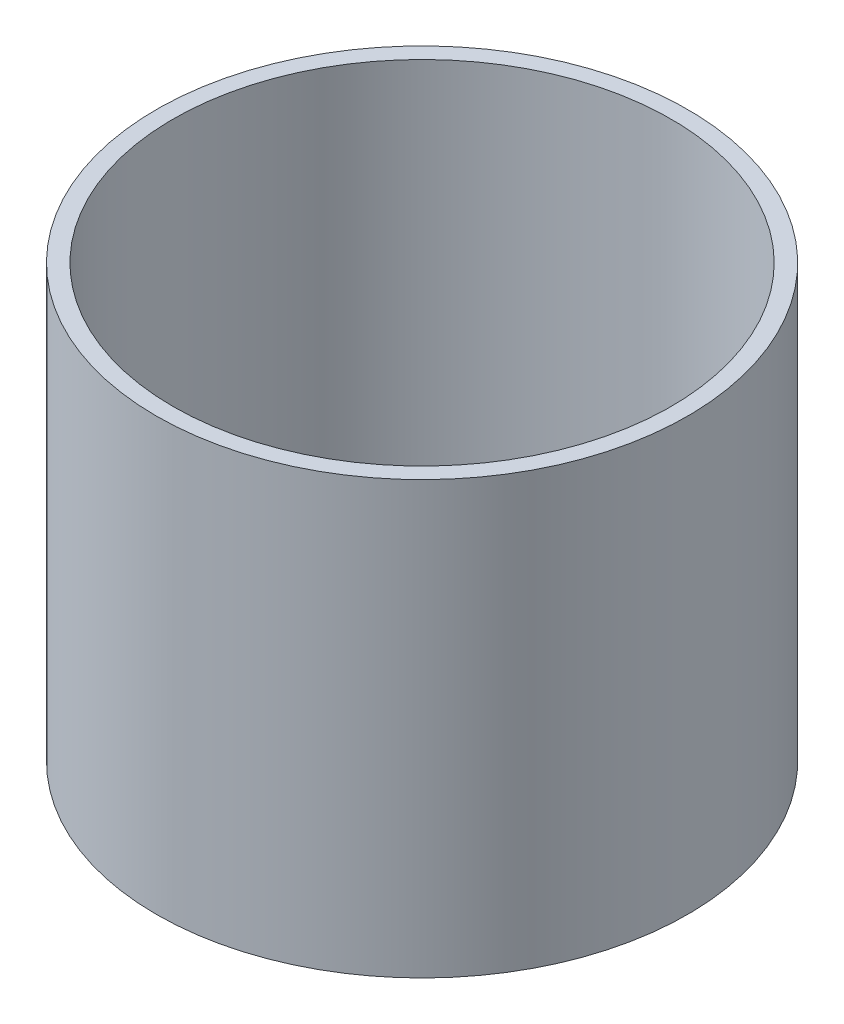
ISO-10303-21;
HEADER;
FILE_DESCRIPTION(('STEP AP214'),'2;1');
FILE_NAME('part.step','',(''),(''),'','','');
FILE_SCHEMA(('AUTOMOTIVE_DESIGN { 1 0 10303 214 1 1 1 1 }'));
ENDSEC;
DATA;
#1=APPLICATION_CONTEXT('core data for automotive mechanical design processes');
#2=APPLICATION_PROTOCOL_DEFINITION('international standard','automotive_design',2000,#1);
#3=PRODUCT_CONTEXT('',#1,'mechanical');
#4=PRODUCT('Part','Part','',(#3));
#5=PRODUCT_RELATED_PRODUCT_CATEGORY('part','',(#4));
#6=PRODUCT_DEFINITION_FORMATION('','',#4);
#7=PRODUCT_DEFINITION_CONTEXT('part definition',#1,'design');
#8=PRODUCT_DEFINITION('design','',#6,#7);
#9=PRODUCT_DEFINITION_SHAPE('','',#8);
#10=(LENGTH_UNIT() NAMED_UNIT(*) SI_UNIT(.MILLI.,.METRE.));
#11=(NAMED_UNIT(*) PLANE_ANGLE_UNIT() SI_UNIT($,.RADIAN.));
#12=(NAMED_UNIT(*) SI_UNIT($,.STERADIAN.) SOLID_ANGLE_UNIT());
#13=UNCERTAINTY_MEASURE_WITH_UNIT(LENGTH_MEASURE(1.E-05),#10,'distance_accuracy_value','');
#14=(GEOMETRIC_REPRESENTATION_CONTEXT(3) GLOBAL_UNCERTAINTY_ASSIGNED_CONTEXT((#13)) GLOBAL_UNIT_ASSIGNED_CONTEXT((#10,
#11,#12)) REPRESENTATION_CONTEXT('',''));
#15=CARTESIAN_POINT('',(0.,0.,0.));
#16=DIRECTION('',(0.,0.,1.));
#17=DIRECTION('',(1.,0.,0.));
#18=AXIS2_PLACEMENT_3D('',#15,#16,#17);
#19=CARTESIAN_POINT('',(0.,65.,0.));
#20=DIRECTION('',(0.,1.,0.));
#21=DIRECTION('',(0.,0.,1.));
#22=AXIS2_PLACEMENT_3D('',#19,#20,#21);
#23=PLANE('',#22);
#24=CARTESIAN_POINT('',(0.,65.,0.));
#25=DIRECTION('',(0.,1.,0.));
#26=DIRECTION('',(0.,0.,1.));
#27=AXIS2_PLACEMENT_3D('',#24,#25,#26);
#28=CIRCLE('',#27,40.);
#29=CARTESIAN_POINT('',(0.,65.,40.));
#30=VERTEX_POINT('',#29);
#31=EDGE_CURVE('E10',#30,#30,#28,.T.);
#32=ORIENTED_EDGE('',*,*,#31,.T.);
#33=EDGE_LOOP('',(#32));
#34=FACE_BOUND('',#33,.T.);
#35=CARTESIAN_POINT('',(0.,65.,0.));
#36=DIRECTION('',(0.,1.,0.));
#37=DIRECTION('',(0.,0.,1.));
#38=AXIS2_PLACEMENT_3D('',#35,#36,#37);
#39=CIRCLE('',#38,37.5);
#40=CARTESIAN_POINT('',(0.,65.,37.5));
#41=VERTEX_POINT('',#40);
#42=EDGE_CURVE('E54',#41,#41,#39,.T.);
#43=ORIENTED_EDGE('',*,*,#42,.F.);
#44=EDGE_LOOP('',(#43));
#45=FACE_BOUND('',#44,.T.);
#46=ADVANCED_FACE('F41',(#34,#45),#23,.T.);
#47=CARTESIAN_POINT('',(0.,0.,0.));
#48=DIRECTION('',(0.,1.,0.));
#49=DIRECTION('',(0.,0.,1.));
#50=AXIS2_PLACEMENT_3D('',#47,#48,#49);
#51=PLANE('',#50);
#52=CARTESIAN_POINT('',(0.,0.,0.));
#53=DIRECTION('',(0.,1.,0.));
#54=DIRECTION('',(0.,0.,1.));
#55=AXIS2_PLACEMENT_3D('',#52,#53,#54);
#56=CIRCLE('',#55,40.);
#57=CARTESIAN_POINT('',(0.,0.,40.));
#58=VERTEX_POINT('',#57);
#59=EDGE_CURVE('E45',#58,#58,#56,.T.);
#60=ORIENTED_EDGE('',*,*,#59,.F.);
#61=EDGE_LOOP('',(#60));
#62=FACE_BOUND('',#61,.T.);
#63=CARTESIAN_POINT('',(0.,0.,0.));
#64=DIRECTION('',(0.,1.,0.));
#65=DIRECTION('',(0.,0.,1.));
#66=AXIS2_PLACEMENT_3D('',#63,#64,#65);
#67=CIRCLE('',#66,37.5);
#68=CARTESIAN_POINT('',(0.,0.,37.5));
#69=VERTEX_POINT('',#68);
#70=EDGE_CURVE('E56',#69,#69,#67,.T.);
#71=ORIENTED_EDGE('',*,*,#70,.T.);
#72=EDGE_LOOP('',(#71));
#73=FACE_BOUND('',#72,.T.);
#74=ADVANCED_FACE('F68',(#62,#73),#51,.F.);
#75=CARTESIAN_POINT('',(0.,65.,0.));
#76=DIRECTION('',(0.,-1.,0.));
#77=DIRECTION('',(0.,0.,-1.));
#78=AXIS2_PLACEMENT_3D('',#75,#76,#77);
#79=CYLINDRICAL_SURFACE('',#78,40.);
#80=ORIENTED_EDGE('',*,*,#31,.F.);
#81=EDGE_LOOP('',(#80));
#82=FACE_BOUND('',#81,.T.);
#83=ORIENTED_EDGE('',*,*,#59,.T.);
#84=EDGE_LOOP('',(#83));
#85=FACE_BOUND('',#84,.T.);
#86=ADVANCED_FACE('F43',(#82,#85),#79,.T.);
#87=CARTESIAN_POINT('',(0.,65.,0.));
#88=DIRECTION('',(0.,-1.,0.));
#89=DIRECTION('',(0.,0.,-1.));
#90=AXIS2_PLACEMENT_3D('',#87,#88,#89);
#91=CYLINDRICAL_SURFACE('',#90,37.5);
#92=ORIENTED_EDGE('',*,*,#42,.T.);
#93=EDGE_LOOP('',(#92));
#94=FACE_BOUND('',#93,.T.);
#95=ORIENTED_EDGE('',*,*,#70,.F.);
#96=EDGE_LOOP('',(#95));
#97=FACE_BOUND('',#96,.T.);
#98=ADVANCED_FACE('F64',(#94,#97),#91,.F.);
#99=CLOSED_SHELL('',(#46,#74,#86,#98));
#100=MANIFOLD_SOLID_BREP('B2',#99);
#101=ADVANCED_BREP_SHAPE_REPRESENTATION('',(#18,#100),#14);
#102=SHAPE_DEFINITION_REPRESENTATION(#9,#101);
ENDSEC;
END-ISO-10303-21;
